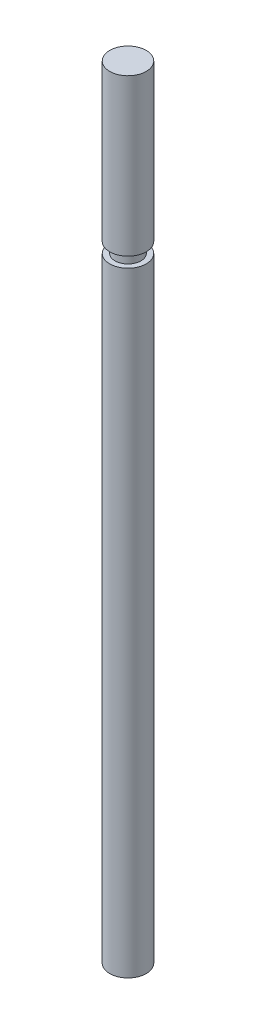
ISO-10303-21;
HEADER;
FILE_DESCRIPTION(('STEP AP214'),'2;1');
FILE_NAME('part.step','',(''),(''),'','','');
FILE_SCHEMA(('AUTOMOTIVE_DESIGN { 1 0 10303 214 1 1 1 1 }'));
ENDSEC;
DATA;
#1=APPLICATION_CONTEXT('core data for automotive mechanical design processes');
#2=APPLICATION_PROTOCOL_DEFINITION('international standard','automotive_design',2000,#1);
#3=PRODUCT_CONTEXT('',#1,'mechanical');
#4=PRODUCT('Part','Part','',(#3));
#5=PRODUCT_RELATED_PRODUCT_CATEGORY('part','',(#4));
#6=PRODUCT_DEFINITION_FORMATION('','',#4);
#7=PRODUCT_DEFINITION_CONTEXT('part definition',#1,'design');
#8=PRODUCT_DEFINITION('design','',#6,#7);
#9=PRODUCT_DEFINITION_SHAPE('','',#8);
#10=(LENGTH_UNIT() NAMED_UNIT(*) SI_UNIT(.MILLI.,.METRE.));
#11=(NAMED_UNIT(*) PLANE_ANGLE_UNIT() SI_UNIT($,.RADIAN.));
#12=(NAMED_UNIT(*) SI_UNIT($,.STERADIAN.) SOLID_ANGLE_UNIT());
#13=UNCERTAINTY_MEASURE_WITH_UNIT(LENGTH_MEASURE(1.E-05),#10,'distance_accuracy_value','');
#14=(GEOMETRIC_REPRESENTATION_CONTEXT(3) GLOBAL_UNCERTAINTY_ASSIGNED_CONTEXT((#13)) GLOBAL_UNIT_ASSIGNED_CONTEXT((#10,
#11,#12)) REPRESENTATION_CONTEXT('',''));
#15=CARTESIAN_POINT('',(0.,0.,0.));
#16=DIRECTION('',(0.,0.,1.));
#17=DIRECTION('',(1.,0.,0.));
#18=AXIS2_PLACEMENT_3D('',#15,#16,#17);
#19=CARTESIAN_POINT('',(0.,75.,0.));
#20=DIRECTION('',(0.,-1.,0.));
#21=DIRECTION('',(0.,0.,-1.));
#22=AXIS2_PLACEMENT_3D('',#19,#20,#21);
#23=CYLINDRICAL_SURFACE('',#22,1.75);
#24=CARTESIAN_POINT('',(0.,0.,0.));
#25=DIRECTION('',(0.,1.,0.));
#26=DIRECTION('',(0.,0.,1.));
#27=AXIS2_PLACEMENT_3D('',#24,#25,#26);
#28=CIRCLE('',#27,1.75);
#29=CARTESIAN_POINT('',(0.,0.,1.75));
#30=VERTEX_POINT('',#29);
#31=EDGE_CURVE('E46',#30,#30,#28,.T.);
#32=ORIENTED_EDGE('',*,*,#31,.T.);
#33=EDGE_LOOP('',(#32));
#34=FACE_BOUND('',#33,.T.);
#35=CARTESIAN_POINT('',(0.,59.,0.));
#36=DIRECTION('',(0.,1.,0.));
#37=DIRECTION('',(0.,0.,1.));
#38=AXIS2_PLACEMENT_3D('',#35,#36,#37);
#39=CIRCLE('',#38,1.75);
#40=CARTESIAN_POINT('',(0.,59.,1.75));
#41=VERTEX_POINT('',#40);
#42=EDGE_CURVE('E55',#41,#41,#39,.T.);
#43=ORIENTED_EDGE('',*,*,#42,.F.);
#44=EDGE_LOOP('',(#43));
#45=FACE_BOUND('',#44,.T.);
#46=ADVANCED_FACE('F42',(#34,#45),#23,.T.);
#47=CARTESIAN_POINT('',(0.,0.,0.));
#48=DIRECTION('',(0.,1.,0.));
#49=DIRECTION('',(0.,0.,1.));
#50=AXIS2_PLACEMENT_3D('',#47,#48,#49);
#51=PLANE('',#50);
#52=ORIENTED_EDGE('',*,*,#31,.F.);
#53=EDGE_LOOP('',(#52));
#54=FACE_BOUND('',#53,.T.);
#55=ADVANCED_FACE('F84',(#54),#51,.F.);
#56=CARTESIAN_POINT('',(0.,59.,0.));
#57=DIRECTION('',(0.,1.,0.));
#58=DIRECTION('',(0.,0.,1.));
#59=AXIS2_PLACEMENT_3D('',#56,#57,#58);
#60=CYLINDRICAL_SURFACE('',#59,1.25);
#61=CARTESIAN_POINT('',(0.,59.,0.));
#62=DIRECTION('',(0.,1.,0.));
#63=DIRECTION('',(0.,0.,1.));
#64=AXIS2_PLACEMENT_3D('',#61,#62,#63);
#65=CIRCLE('',#64,1.25);
#66=CARTESIAN_POINT('',(0.,59.,1.25));
#67=VERTEX_POINT('',#66);
#68=EDGE_CURVE('E61',#67,#67,#65,.T.);
#69=ORIENTED_EDGE('',*,*,#68,.T.);
#70=EDGE_LOOP('',(#69));
#71=FACE_BOUND('',#70,.T.);
#72=CARTESIAN_POINT('',(0.,60.,0.));
#73=DIRECTION('',(0.,1.,0.));
#74=DIRECTION('',(0.,0.,1.));
#75=AXIS2_PLACEMENT_3D('',#72,#73,#74);
#76=CIRCLE('',#75,1.25);
#77=CARTESIAN_POINT('',(0.,60.,1.25));
#78=VERTEX_POINT('',#77);
#79=EDGE_CURVE('E62',#78,#78,#76,.T.);
#80=ORIENTED_EDGE('',*,*,#79,.F.);
#81=EDGE_LOOP('',(#80));
#82=FACE_BOUND('',#81,.T.);
#83=ADVANCED_FACE('F73',(#71,#82),#60,.T.);
#84=CARTESIAN_POINT('',(0.,59.,0.));
#85=DIRECTION('',(0.,1.,0.));
#86=DIRECTION('',(0.,0.,1.));
#87=AXIS2_PLACEMENT_3D('',#84,#85,#86);
#88=PLANE('',#87);
#89=ORIENTED_EDGE('',*,*,#68,.F.);
#90=EDGE_LOOP('',(#89));
#91=FACE_BOUND('',#90,.T.);
#92=ORIENTED_EDGE('',*,*,#42,.T.);
#93=EDGE_LOOP('',(#92));
#94=FACE_BOUND('',#93,.T.);
#95=ADVANCED_FACE('F76',(#91,#94),#88,.T.);
#96=CARTESIAN_POINT('',(0.,60.,0.));
#97=DIRECTION('',(0.,1.,0.));
#98=DIRECTION('',(0.,0.,1.));
#99=AXIS2_PLACEMENT_3D('',#96,#97,#98);
#100=PLANE('',#99);
#101=ORIENTED_EDGE('',*,*,#79,.T.);
#102=EDGE_LOOP('',(#101));
#103=FACE_BOUND('',#102,.T.);
#104=CARTESIAN_POINT('',(0.,60.,0.));
#105=DIRECTION('',(0.,1.,0.));
#106=DIRECTION('',(0.,0.,1.));
#107=AXIS2_PLACEMENT_3D('',#104,#105,#106);
#108=CIRCLE('',#107,1.75);
#109=CARTESIAN_POINT('',(0.,60.,1.75));
#110=VERTEX_POINT('',#109);
#111=EDGE_CURVE('E57',#110,#110,#108,.T.);
#112=ORIENTED_EDGE('',*,*,#111,.F.);
#113=EDGE_LOOP('',(#112));
#114=FACE_BOUND('',#113,.T.);
#115=ADVANCED_FACE('F79',(#103,#114),#100,.F.);
#116=CARTESIAN_POINT('',(0.,75.,0.));
#117=DIRECTION('',(0.,1.,0.));
#118=DIRECTION('',(0.,0.,1.));
#119=AXIS2_PLACEMENT_3D('',#116,#117,#118);
#120=PLANE('',#119);
#121=CARTESIAN_POINT('',(0.,75.,0.));
#122=DIRECTION('',(0.,1.,0.));
#123=DIRECTION('',(0.,0.,1.));
#124=AXIS2_PLACEMENT_3D('',#121,#122,#123);
#125=CIRCLE('',#124,1.75);
#126=CARTESIAN_POINT('',(0.,75.,1.75));
#127=VERTEX_POINT('',#126);
#128=EDGE_CURVE('E10',#127,#127,#125,.T.);
#129=ORIENTED_EDGE('',*,*,#128,.T.);
#130=EDGE_LOOP('',(#129));
#131=FACE_BOUND('',#130,.T.);
#132=ADVANCED_FACE('F91',(#131),#120,.T.);
#133=ORIENTED_EDGE('',*,*,#111,.T.);
#134=EDGE_LOOP('',(#133));
#135=FACE_BOUND('',#134,.T.);
#136=ORIENTED_EDGE('',*,*,#128,.F.);
#137=EDGE_LOOP('',(#136));
#138=FACE_BOUND('',#137,.T.);
#139=ADVANCED_FACE('F44',(#135,#138),#23,.T.);
#140=CLOSED_SHELL('',(#46,#55,#83,#95,#115,#132,#139));
#141=MANIFOLD_SOLID_BREP('B2',#140);
#142=ADVANCED_BREP_SHAPE_REPRESENTATION('',(#18,#141),#14);
#143=SHAPE_DEFINITION_REPRESENTATION(#9,#142);
ENDSEC;
END-ISO-10303-21;
